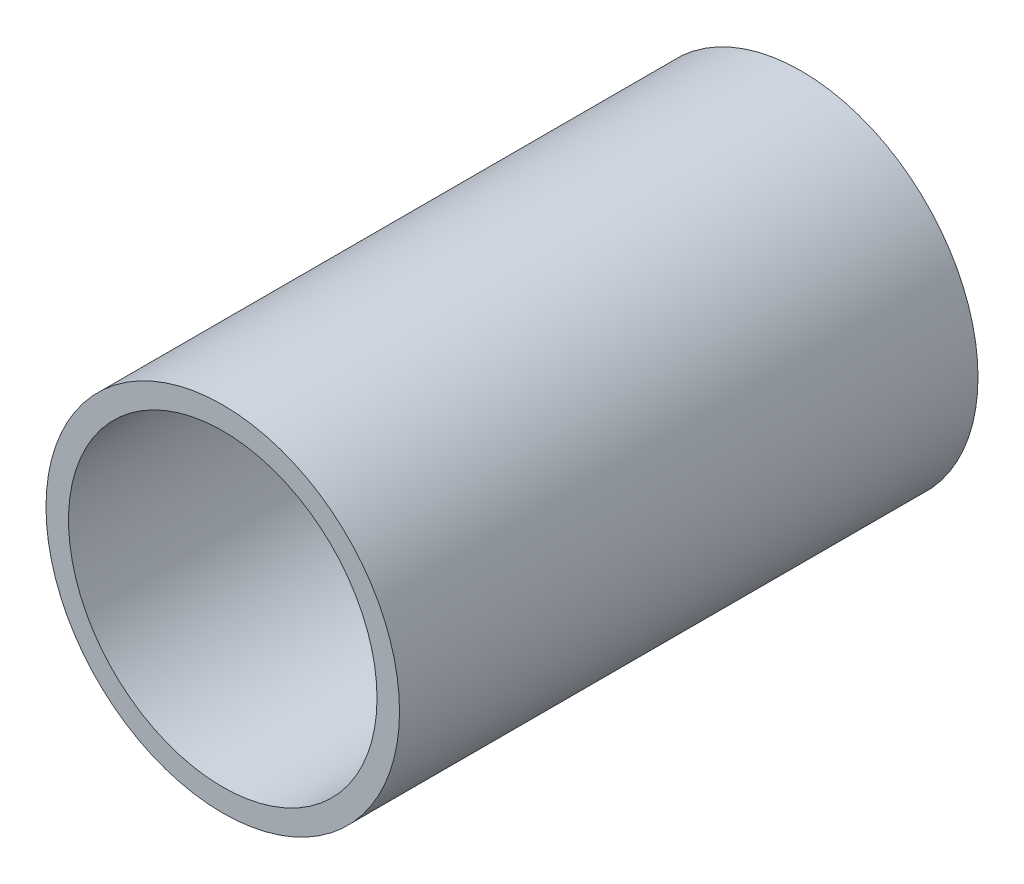
ISO-10303-21;
HEADER;
FILE_DESCRIPTION(('STEP AP214'),'2;1');
FILE_NAME('part.step','',(''),(''),'','','');
FILE_SCHEMA(('AUTOMOTIVE_DESIGN { 1 0 10303 214 1 1 1 1 }'));
ENDSEC;
DATA;
#1=APPLICATION_CONTEXT('core data for automotive mechanical design processes');
#2=APPLICATION_PROTOCOL_DEFINITION('international standard','automotive_design',2000,#1);
#3=PRODUCT_CONTEXT('',#1,'mechanical');
#4=PRODUCT('Part','Part','',(#3));
#5=PRODUCT_RELATED_PRODUCT_CATEGORY('part','',(#4));
#6=PRODUCT_DEFINITION_FORMATION('','',#4);
#7=PRODUCT_DEFINITION_CONTEXT('part definition',#1,'design');
#8=PRODUCT_DEFINITION('design','',#6,#7);
#9=PRODUCT_DEFINITION_SHAPE('','',#8);
#10=(LENGTH_UNIT() NAMED_UNIT(*) SI_UNIT(.MILLI.,.METRE.));
#11=(NAMED_UNIT(*) PLANE_ANGLE_UNIT() SI_UNIT($,.RADIAN.));
#12=(NAMED_UNIT(*) SI_UNIT($,.STERADIAN.) SOLID_ANGLE_UNIT());
#13=UNCERTAINTY_MEASURE_WITH_UNIT(LENGTH_MEASURE(1.E-05),#10,'distance_accuracy_value','');
#14=(GEOMETRIC_REPRESENTATION_CONTEXT(3) GLOBAL_UNCERTAINTY_ASSIGNED_CONTEXT((#13)) GLOBAL_UNIT_ASSIGNED_CONTEXT((#10,
#11,#12)) REPRESENTATION_CONTEXT('',''));
#15=CARTESIAN_POINT('',(0.,0.,0.));
#16=DIRECTION('',(0.,0.,1.));
#17=DIRECTION('',(1.,0.,0.));
#18=AXIS2_PLACEMENT_3D('',#15,#16,#17);
#19=CARTESIAN_POINT('',(0.,0.,72.));
#20=DIRECTION('',(0.,0.,1.));
#21=DIRECTION('',(1.,0.,0.));
#22=AXIS2_PLACEMENT_3D('',#19,#20,#21);
#23=PLANE('',#22);
#24=CARTESIAN_POINT('',(0.,0.,72.));
#25=DIRECTION('',(0.,0.,1.));
#26=DIRECTION('',(1.,0.,0.));
#27=AXIS2_PLACEMENT_3D('',#24,#25,#26);
#28=CIRCLE('',#27,22.);
#29=CARTESIAN_POINT('',(22.,0.,72.));
#30=VERTEX_POINT('',#29);
#31=EDGE_CURVE('E10',#30,#30,#28,.T.);
#32=ORIENTED_EDGE('',*,*,#31,.T.);
#33=EDGE_LOOP('',(#32));
#34=FACE_BOUND('',#33,.T.);
#35=CARTESIAN_POINT('',(0.,0.,72.));
#36=DIRECTION('',(0.,0.,1.));
#37=DIRECTION('',(1.,0.,0.));
#38=AXIS2_PLACEMENT_3D('',#35,#36,#37);
#39=CIRCLE('',#38,19.2);
#40=CARTESIAN_POINT('',(19.2,0.,72.));
#41=VERTEX_POINT('',#40);
#42=EDGE_CURVE('E50',#41,#41,#39,.T.);
#43=ORIENTED_EDGE('',*,*,#42,.F.);
#44=EDGE_LOOP('',(#43));
#45=FACE_BOUND('',#44,.T.);
#46=ADVANCED_FACE('F37',(#34,#45),#23,.T.);
#47=CARTESIAN_POINT('',(0.,0.,0.));
#48=DIRECTION('',(0.,0.,1.));
#49=DIRECTION('',(1.,0.,0.));
#50=AXIS2_PLACEMENT_3D('',#47,#48,#49);
#51=PLANE('',#50);
#52=CARTESIAN_POINT('',(0.,0.,0.));
#53=DIRECTION('',(0.,0.,1.));
#54=DIRECTION('',(1.,0.,0.));
#55=AXIS2_PLACEMENT_3D('',#52,#53,#54);
#56=CIRCLE('',#55,22.);
#57=CARTESIAN_POINT('',(22.,0.,0.));
#58=VERTEX_POINT('',#57);
#59=EDGE_CURVE('E41',#58,#58,#56,.T.);
#60=ORIENTED_EDGE('',*,*,#59,.F.);
#61=EDGE_LOOP('',(#60));
#62=FACE_BOUND('',#61,.T.);
#63=CARTESIAN_POINT('',(0.,0.,0.));
#64=DIRECTION('',(0.,0.,1.));
#65=DIRECTION('',(1.,0.,0.));
#66=AXIS2_PLACEMENT_3D('',#63,#64,#65);
#67=CIRCLE('',#66,19.2);
#68=CARTESIAN_POINT('',(19.2,0.,0.));
#69=VERTEX_POINT('',#68);
#70=EDGE_CURVE('E52',#69,#69,#67,.T.);
#71=ORIENTED_EDGE('',*,*,#70,.T.);
#72=EDGE_LOOP('',(#71));
#73=FACE_BOUND('',#72,.T.);
#74=ADVANCED_FACE('F64',(#62,#73),#51,.F.);
#75=CARTESIAN_POINT('',(0.,0.,72.));
#76=DIRECTION('',(0.,0.,-1.));
#77=DIRECTION('',(-1.,0.,0.));
#78=AXIS2_PLACEMENT_3D('',#75,#76,#77);
#79=CYLINDRICAL_SURFACE('',#78,22.);
#80=ORIENTED_EDGE('',*,*,#31,.F.);
#81=EDGE_LOOP('',(#80));
#82=FACE_BOUND('',#81,.T.);
#83=ORIENTED_EDGE('',*,*,#59,.T.);
#84=EDGE_LOOP('',(#83));
#85=FACE_BOUND('',#84,.T.);
#86=ADVANCED_FACE('F39',(#82,#85),#79,.T.);
#87=CARTESIAN_POINT('',(0.,0.,72.));
#88=DIRECTION('',(0.,0.,-1.));
#89=DIRECTION('',(-1.,0.,0.));
#90=AXIS2_PLACEMENT_3D('',#87,#88,#89);
#91=CYLINDRICAL_SURFACE('',#90,19.2);
#92=ORIENTED_EDGE('',*,*,#42,.T.);
#93=EDGE_LOOP('',(#92));
#94=FACE_BOUND('',#93,.T.);
#95=ORIENTED_EDGE('',*,*,#70,.F.);
#96=EDGE_LOOP('',(#95));
#97=FACE_BOUND('',#96,.T.);
#98=ADVANCED_FACE('F60',(#94,#97),#91,.F.);
#99=CLOSED_SHELL('',(#46,#74,#86,#98));
#100=MANIFOLD_SOLID_BREP('B2',#99);
#101=ADVANCED_BREP_SHAPE_REPRESENTATION('',(#18,#100),#14);
#102=SHAPE_DEFINITION_REPRESENTATION(#9,#101);
ENDSEC;
END-ISO-10303-21;
